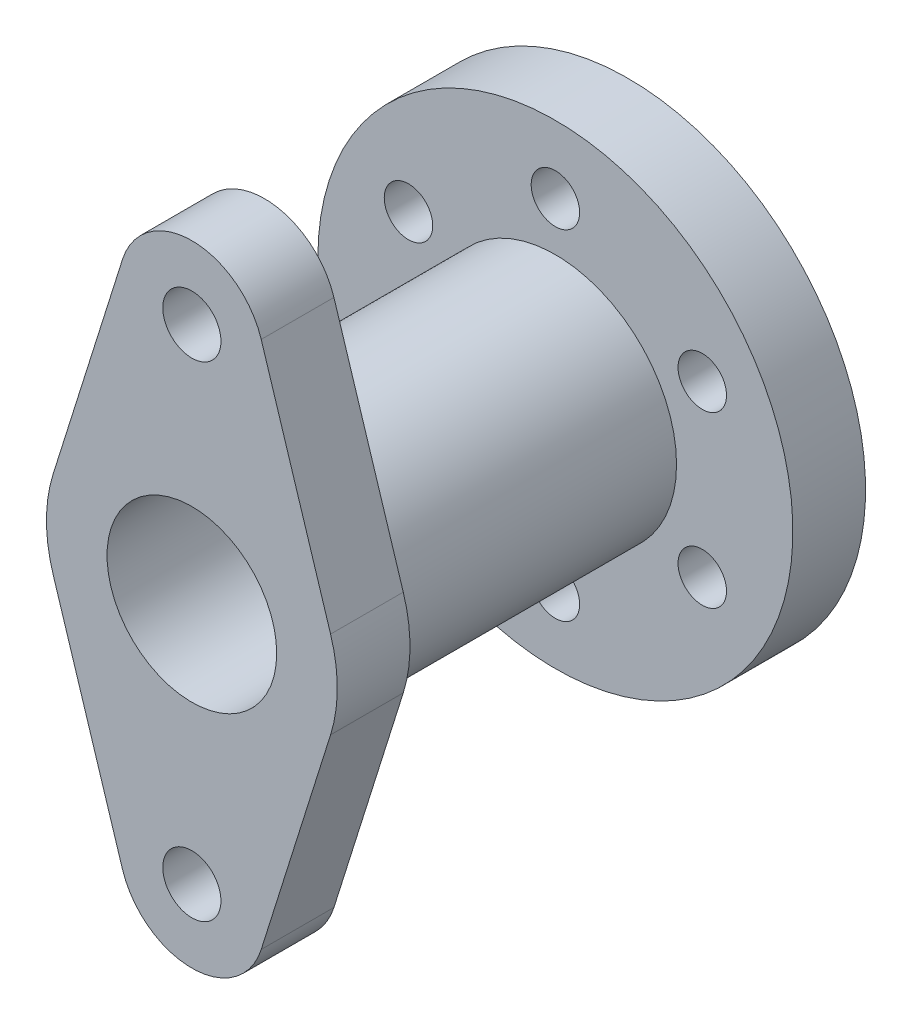
ISO-10303-21;
HEADER;
FILE_DESCRIPTION(('STEP AP214'),'2;1');
FILE_NAME('part.step','',(''),(''),'','','');
FILE_SCHEMA(('AUTOMOTIVE_DESIGN { 1 0 10303 214 1 1 1 1 }'));
ENDSEC;
DATA;
#1=APPLICATION_CONTEXT('core data for automotive mechanical design processes');
#2=APPLICATION_PROTOCOL_DEFINITION('international standard','automotive_design',2000,#1);
#3=PRODUCT_CONTEXT('',#1,'mechanical');
#4=PRODUCT('Part','Part','',(#3));
#5=PRODUCT_RELATED_PRODUCT_CATEGORY('part','',(#4));
#6=PRODUCT_DEFINITION_FORMATION('','',#4);
#7=PRODUCT_DEFINITION_CONTEXT('part definition',#1,'design');
#8=PRODUCT_DEFINITION('design','',#6,#7);
#9=PRODUCT_DEFINITION_SHAPE('','',#8);
#10=(LENGTH_UNIT() NAMED_UNIT(*) SI_UNIT(.MILLI.,.METRE.));
#11=(NAMED_UNIT(*) PLANE_ANGLE_UNIT() SI_UNIT($,.RADIAN.));
#12=(NAMED_UNIT(*) SI_UNIT($,.STERADIAN.) SOLID_ANGLE_UNIT());
#13=UNCERTAINTY_MEASURE_WITH_UNIT(LENGTH_MEASURE(1.E-05),#10,'distance_accuracy_value','');
#14=(GEOMETRIC_REPRESENTATION_CONTEXT(3) GLOBAL_UNCERTAINTY_ASSIGNED_CONTEXT((#13)) GLOBAL_UNIT_ASSIGNED_CONTEXT((#10,
#11,#12)) REPRESENTATION_CONTEXT('',''));
#15=CARTESIAN_POINT('',(0.,0.,0.));
#16=DIRECTION('',(0.,0.,1.));
#17=DIRECTION('',(1.,0.,0.));
#18=AXIS2_PLACEMENT_3D('',#15,#16,#17);
#19=CARTESIAN_POINT('',(0.,0.,15.));
#20=DIRECTION('',(0.,0.,1.));
#21=DIRECTION('',(1.,0.,0.));
#22=AXIS2_PLACEMENT_3D('',#19,#20,#21);
#23=PLANE('',#22);
#24=CARTESIAN_POINT('',(3.46944695195361E-13,-50.0000000000002,15.));
#25=DIRECTION('',(0.,0.,1.));
#26=DIRECTION('',(-1.,0.,0.));
#27=AXIS2_PLACEMENT_3D('',#24,#25,#26);
#28=CIRCLE('',#27,6.);
#29=CARTESIAN_POINT('',(-5.99999999999965,-50.0000000000002,15.));
#30=VERTEX_POINT('',#29);
#31=EDGE_CURVE('E186',#30,#30,#28,.T.);
#32=ORIENTED_EDGE('',*,*,#31,.F.);
#33=EDGE_LOOP('',(#32));
#34=FACE_BOUND('',#33,.T.);
#35=CARTESIAN_POINT('',(0.,0.,15.));
#36=DIRECTION('',(0.,0.,1.));
#37=DIRECTION('',(1.,0.,0.));
#38=AXIS2_PLACEMENT_3D('',#35,#36,#37);
#39=CIRCLE('',#38,30.);
#40=CARTESIAN_POINT('',(28.6181760425084,-9.,15.));
#41=VERTEX_POINT('',#40);
#42=CARTESIAN_POINT('',(28.6181760425084,9.,15.));
#43=VERTEX_POINT('',#42);
#44=EDGE_CURVE('E145',#41,#43,#39,.T.);
#45=ORIENTED_EDGE('',*,*,#44,.T.);
#46=DIRECTION('',(-0.3,0.953939201416946,0.));
#47=VECTOR('',#46,1.);
#48=CARTESIAN_POINT('',(14.3090880212542,54.5,15.));
#49=LINE('',#48,#47);
#50=CARTESIAN_POINT('',(14.3090880212542,54.5,15.));
#51=VERTEX_POINT('',#50);
#52=EDGE_CURVE('E93',#43,#51,#49,.T.);
#53=ORIENTED_EDGE('',*,*,#52,.T.);
#54=CARTESIAN_POINT('',(0.,50.,15.));
#55=DIRECTION('',(0.,0.,1.));
#56=DIRECTION('',(1.,0.,0.));
#57=AXIS2_PLACEMENT_3D('',#54,#55,#56);
#58=CIRCLE('',#57,15.);
#59=CARTESIAN_POINT('',(-14.3090880212542,54.5,15.));
#60=VERTEX_POINT('',#59);
#61=EDGE_CURVE('E177',#51,#60,#58,.T.);
#62=ORIENTED_EDGE('',*,*,#61,.T.);
#63=DIRECTION('',(-0.3,-0.953939201416946,0.));
#64=VECTOR('',#63,1.);
#65=CARTESIAN_POINT('',(-14.3090880212542,54.5,15.));
#66=LINE('',#65,#64);
#67=CARTESIAN_POINT('',(-28.6181760425084,9.00000000000001,15.));
#68=VERTEX_POINT('',#67);
#69=EDGE_CURVE('E176',#60,#68,#66,.T.);
#70=ORIENTED_EDGE('',*,*,#69,.T.);
#71=CARTESIAN_POINT('',(0.,0.,15.));
#72=DIRECTION('',(0.,0.,1.));
#73=DIRECTION('',(1.,0.,0.));
#74=AXIS2_PLACEMENT_3D('',#71,#72,#73);
#75=CIRCLE('',#74,30.);
#76=CARTESIAN_POINT('',(-28.6181760425084,-9.00000000000001,15.));
#77=VERTEX_POINT('',#76);
#78=EDGE_CURVE('E112',#68,#77,#75,.T.);
#79=ORIENTED_EDGE('',*,*,#78,.T.);
#80=DIRECTION('',(0.3,-0.953939201416946,0.));
#81=VECTOR('',#80,1.);
#82=CARTESIAN_POINT('',(-14.3090880212542,-54.5,15.));
#83=LINE('',#82,#81);
#84=CARTESIAN_POINT('',(-14.3090880212539,-54.4999999999999,15.));
#85=VERTEX_POINT('',#84);
#86=EDGE_CURVE('E106',#77,#85,#83,.T.);
#87=ORIENTED_EDGE('',*,*,#86,.T.);
#88=CARTESIAN_POINT('',(3.46944695195361E-13,-50.0000000000002,15.));
#89=DIRECTION('',(0.,0.,1.));
#90=DIRECTION('',(-1.,0.,0.));
#91=AXIS2_PLACEMENT_3D('',#88,#89,#90);
#92=CIRCLE('',#91,14.9999999999999);
#93=CARTESIAN_POINT('',(14.3090880212542,-54.5,15.));
#94=VERTEX_POINT('',#93);
#95=EDGE_CURVE('E110',#85,#94,#92,.T.);
#96=ORIENTED_EDGE('',*,*,#95,.T.);
#97=DIRECTION('',(0.3,0.953939201416946,0.));
#98=VECTOR('',#97,1.);
#99=CARTESIAN_POINT('',(14.3090880212542,-54.5,15.));
#100=LINE('',#99,#98);
#101=EDGE_CURVE('E49',#94,#41,#100,.T.);
#102=ORIENTED_EDGE('',*,*,#101,.T.);
#103=EDGE_LOOP('',(#45,#53,#62,#70,#79,#87,#96,#102));
#104=FACE_BOUND('',#103,.T.);
#105=CARTESIAN_POINT('',(0.,50.,15.));
#106=DIRECTION('',(0.,0.,1.));
#107=DIRECTION('',(1.,0.,0.));
#108=AXIS2_PLACEMENT_3D('',#105,#106,#107);
#109=CIRCLE('',#108,6.);
#110=CARTESIAN_POINT('',(6.,50.,15.));
#111=VERTEX_POINT('',#110);
#112=EDGE_CURVE('E134',#111,#111,#109,.T.);
#113=ORIENTED_EDGE('',*,*,#112,.F.);
#114=EDGE_LOOP('',(#113));
#115=FACE_BOUND('',#114,.T.);
#116=CARTESIAN_POINT('',(0.,0.,15.));
#117=DIRECTION('',(0.,0.,1.));
#118=DIRECTION('',(1.,0.,0.));
#119=AXIS2_PLACEMENT_3D('',#116,#117,#118);
#120=CIRCLE('',#119,17.5);
#121=CARTESIAN_POINT('',(17.5,0.,15.));
#122=VERTEX_POINT('',#121);
#123=EDGE_CURVE('E192',#122,#122,#120,.T.);
#124=ORIENTED_EDGE('',*,*,#123,.F.);
#125=EDGE_LOOP('',(#124));
#126=FACE_BOUND('',#125,.T.);
#127=ADVANCED_FACE('F32',(#34,#104,#115,#126),#23,.T.);
#128=CARTESIAN_POINT('',(0.,0.,0.));
#129=DIRECTION('',(0.,0.,1.));
#130=DIRECTION('',(1.,0.,0.));
#131=AXIS2_PLACEMENT_3D('',#128,#129,#130);
#132=PLANE('',#131);
#133=CARTESIAN_POINT('',(0.,0.,0.));
#134=DIRECTION('',(0.,0.,1.));
#135=DIRECTION('',(1.,0.,0.));
#136=AXIS2_PLACEMENT_3D('',#133,#134,#135);
#137=CIRCLE('',#136,25.);
#138=CARTESIAN_POINT('',(25.,0.,0.));
#139=VERTEX_POINT('',#138);
#140=EDGE_CURVE('E11',#139,#139,#137,.F.);
#141=ORIENTED_EDGE('',*,*,#140,.F.);
#142=EDGE_LOOP('',(#141));
#143=FACE_BOUND('',#142,.T.);
#144=CARTESIAN_POINT('',(0.,0.,0.));
#145=DIRECTION('',(0.,0.,1.));
#146=DIRECTION('',(1.,0.,0.));
#147=AXIS2_PLACEMENT_3D('',#144,#145,#146);
#148=CIRCLE('',#147,30.);
#149=CARTESIAN_POINT('',(28.6181760425084,-9.,0.));
#150=VERTEX_POINT('',#149);
#151=CARTESIAN_POINT('',(28.6181760425084,9.,0.));
#152=VERTEX_POINT('',#151);
#153=EDGE_CURVE('E130',#150,#152,#148,.T.);
#154=ORIENTED_EDGE('',*,*,#153,.F.);
#155=DIRECTION('',(0.3,0.953939201416946,0.));
#156=VECTOR('',#155,1.);
#157=CARTESIAN_POINT('',(14.3090880212542,-54.5,0.));
#158=LINE('',#157,#156);
#159=CARTESIAN_POINT('',(14.3090880212542,-54.5,0.));
#160=VERTEX_POINT('',#159);
#161=EDGE_CURVE('E84',#160,#150,#158,.T.);
#162=ORIENTED_EDGE('',*,*,#161,.F.);
#163=CARTESIAN_POINT('',(3.46944695195361E-13,-50.0000000000002,0.));
#164=DIRECTION('',(0.,0.,1.));
#165=DIRECTION('',(-1.,0.,0.));
#166=AXIS2_PLACEMENT_3D('',#163,#164,#165);
#167=CIRCLE('',#166,14.9999999999999);
#168=CARTESIAN_POINT('',(-14.3090880212539,-54.4999999999999,0.));
#169=VERTEX_POINT('',#168);
#170=EDGE_CURVE('E78',#169,#160,#167,.T.);
#171=ORIENTED_EDGE('',*,*,#170,.F.);
#172=DIRECTION('',(0.3,-0.953939201416946,0.));
#173=VECTOR('',#172,1.);
#174=CARTESIAN_POINT('',(-14.3090880212542,-54.5,0.));
#175=LINE('',#174,#173);
#176=CARTESIAN_POINT('',(-28.6181760425084,-9.00000000000001,0.));
#177=VERTEX_POINT('',#176);
#178=EDGE_CURVE('E120',#177,#169,#175,.T.);
#179=ORIENTED_EDGE('',*,*,#178,.F.);
#180=CARTESIAN_POINT('',(0.,0.,0.));
#181=DIRECTION('',(0.,0.,1.));
#182=DIRECTION('',(1.,0.,0.));
#183=AXIS2_PLACEMENT_3D('',#180,#181,#182);
#184=CIRCLE('',#183,30.);
#185=CARTESIAN_POINT('',(-28.6181760425084,9.00000000000001,0.));
#186=VERTEX_POINT('',#185);
#187=EDGE_CURVE('E140',#186,#177,#184,.T.);
#188=ORIENTED_EDGE('',*,*,#187,.F.);
#189=DIRECTION('',(-0.3,-0.953939201416946,0.));
#190=VECTOR('',#189,1.);
#191=CARTESIAN_POINT('',(-14.3090880212542,54.5,0.));
#192=LINE('',#191,#190);
#193=CARTESIAN_POINT('',(-14.3090880212542,54.5,0.));
#194=VERTEX_POINT('',#193);
#195=EDGE_CURVE('E138',#194,#186,#192,.T.);
#196=ORIENTED_EDGE('',*,*,#195,.F.);
#197=CARTESIAN_POINT('',(0.,50.,0.));
#198=DIRECTION('',(0.,0.,1.));
#199=DIRECTION('',(1.,0.,0.));
#200=AXIS2_PLACEMENT_3D('',#197,#198,#199);
#201=CIRCLE('',#200,15.);
#202=CARTESIAN_POINT('',(14.3090880212542,54.5,0.));
#203=VERTEX_POINT('',#202);
#204=EDGE_CURVE('E136',#203,#194,#201,.T.);
#205=ORIENTED_EDGE('',*,*,#204,.F.);
#206=DIRECTION('',(-0.3,0.953939201416946,0.));
#207=VECTOR('',#206,1.);
#208=CARTESIAN_POINT('',(14.3090880212542,54.5,0.));
#209=LINE('',#208,#207);
#210=EDGE_CURVE('E133',#152,#203,#209,.T.);
#211=ORIENTED_EDGE('',*,*,#210,.F.);
#212=EDGE_LOOP('',(#154,#162,#171,#179,#188,#196,#205,#211));
#213=FACE_BOUND('',#212,.T.);
#214=CARTESIAN_POINT('',(0.,50.,0.));
#215=DIRECTION('',(0.,0.,1.));
#216=DIRECTION('',(1.,0.,0.));
#217=AXIS2_PLACEMENT_3D('',#214,#215,#216);
#218=CIRCLE('',#217,6.);
#219=CARTESIAN_POINT('',(6.,50.,0.));
#220=VERTEX_POINT('',#219);
#221=EDGE_CURVE('E183',#220,#220,#218,.T.);
#222=ORIENTED_EDGE('',*,*,#221,.T.);
#223=EDGE_LOOP('',(#222));
#224=FACE_BOUND('',#223,.T.);
#225=CARTESIAN_POINT('',(3.46944695195361E-13,-50.0000000000002,0.));
#226=DIRECTION('',(0.,0.,1.));
#227=DIRECTION('',(-1.,0.,0.));
#228=AXIS2_PLACEMENT_3D('',#225,#226,#227);
#229=CIRCLE('',#228,6.);
#230=CARTESIAN_POINT('',(-5.99999999999965,-50.0000000000002,0.));
#231=VERTEX_POINT('',#230);
#232=EDGE_CURVE('E189',#231,#231,#229,.T.);
#233=ORIENTED_EDGE('',*,*,#232,.T.);
#234=EDGE_LOOP('',(#233));
#235=FACE_BOUND('',#234,.T.);
#236=ADVANCED_FACE('F163',(#143,#213,#224,#235),#132,.F.);
#237=CARTESIAN_POINT('',(0.,0.,15.));
#238=DIRECTION('',(0.,0.,-1.));
#239=DIRECTION('',(-1.,0.,0.));
#240=AXIS2_PLACEMENT_3D('',#237,#238,#239);
#241=CYLINDRICAL_SURFACE('',#240,30.);
#242=ORIENTED_EDGE('',*,*,#153,.T.);
#243=DIRECTION('',(0.,0.,-1.));
#244=VECTOR('',#243,1.);
#245=CARTESIAN_POINT('',(28.6181760425084,9.,15.));
#246=LINE('',#245,#244);
#247=EDGE_CURVE('E41',#43,#152,#246,.T.);
#248=ORIENTED_EDGE('',*,*,#247,.F.);
#249=ORIENTED_EDGE('',*,*,#44,.F.);
#250=DIRECTION('',(0.,0.,-1.));
#251=VECTOR('',#250,1.);
#252=CARTESIAN_POINT('',(28.6181760425084,-9.,15.));
#253=LINE('',#252,#251);
#254=EDGE_CURVE('E126',#41,#150,#253,.T.);
#255=ORIENTED_EDGE('',*,*,#254,.T.);
#256=EDGE_LOOP('',(#242,#248,#249,#255));
#257=FACE_BOUND('',#256,.T.);
#258=ADVANCED_FACE('F34',(#257),#241,.T.);
#259=CARTESIAN_POINT('',(14.3090880212542,54.5,15.));
#260=DIRECTION('',(-0.953939201416946,-0.3,0.));
#261=DIRECTION('',(0.3,-0.953939201416946,0.));
#262=AXIS2_PLACEMENT_3D('',#259,#260,#261);
#263=PLANE('',#262);
#264=ORIENTED_EDGE('',*,*,#210,.T.);
#265=DIRECTION('',(0.,0.,-1.));
#266=VECTOR('',#265,1.);
#267=CARTESIAN_POINT('',(14.3090880212542,54.5,15.));
#268=LINE('',#267,#266);
#269=EDGE_CURVE('E155',#51,#203,#268,.T.);
#270=ORIENTED_EDGE('',*,*,#269,.F.);
#271=ORIENTED_EDGE('',*,*,#52,.F.);
#272=ORIENTED_EDGE('',*,*,#247,.T.);
#273=EDGE_LOOP('',(#264,#270,#271,#272));
#274=FACE_BOUND('',#273,.T.);
#275=ADVANCED_FACE('F158',(#274),#263,.F.);
#276=CARTESIAN_POINT('',(0.,50.,15.));
#277=DIRECTION('',(0.,0.,-1.));
#278=DIRECTION('',(-1.,0.,0.));
#279=AXIS2_PLACEMENT_3D('',#276,#277,#278);
#280=CYLINDRICAL_SURFACE('',#279,15.);
#281=ORIENTED_EDGE('',*,*,#204,.T.);
#282=DIRECTION('',(0.,0.,-1.));
#283=VECTOR('',#282,1.);
#284=CARTESIAN_POINT('',(-14.3090880212542,54.5,15.));
#285=LINE('',#284,#283);
#286=EDGE_CURVE('E152',#60,#194,#285,.T.);
#287=ORIENTED_EDGE('',*,*,#286,.F.);
#288=ORIENTED_EDGE('',*,*,#61,.F.);
#289=ORIENTED_EDGE('',*,*,#269,.T.);
#290=EDGE_LOOP('',(#281,#287,#288,#289));
#291=FACE_BOUND('',#290,.T.);
#292=ADVANCED_FACE('F170',(#291),#280,.T.);
#293=CARTESIAN_POINT('',(-14.3090880212542,54.5,15.));
#294=DIRECTION('',(0.953939201416946,-0.3,0.));
#295=DIRECTION('',(0.3,0.953939201416946,0.));
#296=AXIS2_PLACEMENT_3D('',#293,#294,#295);
#297=PLANE('',#296);
#298=ORIENTED_EDGE('',*,*,#195,.T.);
#299=DIRECTION('',(0.,0.,-1.));
#300=VECTOR('',#299,1.);
#301=CARTESIAN_POINT('',(-28.6181760425084,9.00000000000001,15.));
#302=LINE('',#301,#300);
#303=EDGE_CURVE('E149',#68,#186,#302,.T.);
#304=ORIENTED_EDGE('',*,*,#303,.F.);
#305=ORIENTED_EDGE('',*,*,#69,.F.);
#306=ORIENTED_EDGE('',*,*,#286,.T.);
#307=EDGE_LOOP('',(#298,#304,#305,#306));
#308=FACE_BOUND('',#307,.T.);
#309=ADVANCED_FACE('F174',(#308),#297,.F.);
#310=CARTESIAN_POINT('',(0.,0.,15.));
#311=DIRECTION('',(0.,0.,-1.));
#312=DIRECTION('',(-1.,0.,0.));
#313=AXIS2_PLACEMENT_3D('',#310,#311,#312);
#314=CYLINDRICAL_SURFACE('',#313,30.);
#315=ORIENTED_EDGE('',*,*,#187,.T.);
#316=DIRECTION('',(0.,0.,-1.));
#317=VECTOR('',#316,1.);
#318=CARTESIAN_POINT('',(-28.6181760425084,-9.00000000000001,15.));
#319=LINE('',#318,#317);
#320=EDGE_CURVE('E121',#77,#177,#319,.T.);
#321=ORIENTED_EDGE('',*,*,#320,.F.);
#322=ORIENTED_EDGE('',*,*,#78,.F.);
#323=ORIENTED_EDGE('',*,*,#303,.T.);
#324=EDGE_LOOP('',(#315,#321,#322,#323));
#325=FACE_BOUND('',#324,.T.);
#326=ADVANCED_FACE('F283',(#325),#314,.T.);
#327=CARTESIAN_POINT('',(-14.3090880212542,-54.5,15.));
#328=DIRECTION('',(0.953939201416946,0.3,0.));
#329=DIRECTION('',(-0.3,0.953939201416946,0.));
#330=AXIS2_PLACEMENT_3D('',#327,#328,#329);
#331=PLANE('',#330);
#332=ORIENTED_EDGE('',*,*,#178,.T.);
#333=DIRECTION('',(0.,0.,-1.));
#334=VECTOR('',#333,1.);
#335=CARTESIAN_POINT('',(-14.3090880212539,-54.4999999999999,15.));
#336=LINE('',#335,#334);
#337=EDGE_CURVE('E117',#85,#169,#336,.T.);
#338=ORIENTED_EDGE('',*,*,#337,.F.);
#339=ORIENTED_EDGE('',*,*,#86,.F.);
#340=ORIENTED_EDGE('',*,*,#320,.T.);
#341=EDGE_LOOP('',(#332,#338,#339,#340));
#342=FACE_BOUND('',#341,.T.);
#343=ADVANCED_FACE('F118',(#342),#331,.F.);
#344=CARTESIAN_POINT('',(3.46944695195361E-13,-50.0000000000002,15.));
#345=DIRECTION('',(0.,0.,-1.));
#346=DIRECTION('',(-1.,0.,0.));
#347=AXIS2_PLACEMENT_3D('',#344,#345,#346);
#348=CYLINDRICAL_SURFACE('',#347,14.9999999999999);
#349=ORIENTED_EDGE('',*,*,#170,.T.);
#350=DIRECTION('',(0.,0.,-1.));
#351=VECTOR('',#350,1.);
#352=CARTESIAN_POINT('',(14.3090880212542,-54.5,15.));
#353=LINE('',#352,#351);
#354=EDGE_CURVE('E122',#94,#160,#353,.T.);
#355=ORIENTED_EDGE('',*,*,#354,.F.);
#356=ORIENTED_EDGE('',*,*,#95,.F.);
#357=ORIENTED_EDGE('',*,*,#337,.T.);
#358=EDGE_LOOP('',(#349,#355,#356,#357));
#359=FACE_BOUND('',#358,.T.);
#360=ADVANCED_FACE('F124',(#359),#348,.T.);
#361=CARTESIAN_POINT('',(14.3090880212542,-54.5,15.));
#362=DIRECTION('',(-0.953939201416946,0.3,0.));
#363=DIRECTION('',(-0.3,-0.953939201416946,0.));
#364=AXIS2_PLACEMENT_3D('',#361,#362,#363);
#365=PLANE('',#364);
#366=ORIENTED_EDGE('',*,*,#161,.T.);
#367=ORIENTED_EDGE('',*,*,#254,.F.);
#368=ORIENTED_EDGE('',*,*,#101,.F.);
#369=ORIENTED_EDGE('',*,*,#354,.T.);
#370=EDGE_LOOP('',(#366,#367,#368,#369));
#371=FACE_BOUND('',#370,.T.);
#372=ADVANCED_FACE('F276',(#371),#365,.F.);
#373=CARTESIAN_POINT('',(0.,50.,15.));
#374=DIRECTION('',(0.,0.,-1.));
#375=DIRECTION('',(-1.,0.,0.));
#376=AXIS2_PLACEMENT_3D('',#373,#374,#375);
#377=CYLINDRICAL_SURFACE('',#376,6.);
#378=ORIENTED_EDGE('',*,*,#112,.T.);
#379=EDGE_LOOP('',(#378));
#380=FACE_BOUND('',#379,.T.);
#381=ORIENTED_EDGE('',*,*,#221,.F.);
#382=EDGE_LOOP('',(#381));
#383=FACE_BOUND('',#382,.T.);
#384=ADVANCED_FACE('F262',(#380,#383),#377,.F.);
#385=CARTESIAN_POINT('',(3.46944695195361E-13,-50.0000000000002,15.));
#386=DIRECTION('',(0.,0.,-1.));
#387=DIRECTION('',(-1.,0.,0.));
#388=AXIS2_PLACEMENT_3D('',#385,#386,#387);
#389=CYLINDRICAL_SURFACE('',#388,6.);
#390=ORIENTED_EDGE('',*,*,#31,.T.);
#391=EDGE_LOOP('',(#390));
#392=FACE_BOUND('',#391,.T.);
#393=ORIENTED_EDGE('',*,*,#232,.F.);
#394=EDGE_LOOP('',(#393));
#395=FACE_BOUND('',#394,.T.);
#396=ADVANCED_FACE('F252',(#392,#395),#389,.F.);
#397=CARTESIAN_POINT('',(0.,0.,15.));
#398=DIRECTION('',(0.,0.,-1.));
#399=DIRECTION('',(-1.,0.,0.));
#400=AXIS2_PLACEMENT_3D('',#397,#398,#399);
#401=CYLINDRICAL_SURFACE('',#400,17.5);
#402=ORIENTED_EDGE('',*,*,#123,.T.);
#403=EDGE_LOOP('',(#402));
#404=FACE_BOUND('',#403,.T.);
#405=CARTESIAN_POINT('',(0.,0.,-75.));
#406=DIRECTION('',(0.,0.,1.));
#407=DIRECTION('',(1.,0.,0.));
#408=AXIS2_PLACEMENT_3D('',#405,#406,#407);
#409=CIRCLE('',#408,17.5);
#410=CARTESIAN_POINT('',(17.5,0.,-75.));
#411=VERTEX_POINT('',#410);
#412=EDGE_CURVE('E240',#411,#411,#409,.T.);
#413=ORIENTED_EDGE('',*,*,#412,.F.);
#414=EDGE_LOOP('',(#413));
#415=FACE_BOUND('',#414,.T.);
#416=ADVANCED_FACE('F249',(#404,#415),#401,.F.);
#417=CARTESIAN_POINT('',(0.,0.,-60.));
#418=DIRECTION('',(0.,0.,1.));
#419=DIRECTION('',(1.,0.,0.));
#420=AXIS2_PLACEMENT_3D('',#417,#418,#419);
#421=CYLINDRICAL_SURFACE('',#420,25.);
#422=CARTESIAN_POINT('',(0.,0.,-60.));
#423=DIRECTION('',(0.,0.,-1.));
#424=DIRECTION('',(-1.,0.,0.));
#425=AXIS2_PLACEMENT_3D('',#422,#423,#424);
#426=CIRCLE('',#425,25.);
#427=CARTESIAN_POINT('',(-25.,0.,-60.));
#428=VERTEX_POINT('',#427);
#429=EDGE_CURVE('E197',#428,#428,#426,.T.);
#430=ORIENTED_EDGE('',*,*,#429,.F.);
#431=EDGE_LOOP('',(#430));
#432=FACE_BOUND('',#431,.T.);
#433=ORIENTED_EDGE('',*,*,#140,.T.);
#434=EDGE_LOOP('',(#433));
#435=FACE_BOUND('',#434,.T.);
#436=ADVANCED_FACE('F251',(#432,#435),#421,.T.);
#437=CARTESIAN_POINT('',(0.,0.,-75.));
#438=DIRECTION('',(0.,0.,1.));
#439=DIRECTION('',(1.,0.,0.));
#440=AXIS2_PLACEMENT_3D('',#437,#438,#439);
#441=CYLINDRICAL_SURFACE('',#440,49.);
#442=CARTESIAN_POINT('',(0.,0.,-75.));
#443=DIRECTION('',(0.,0.,-1.));
#444=DIRECTION('',(-1.,0.,0.));
#445=AXIS2_PLACEMENT_3D('',#442,#443,#444);
#446=CIRCLE('',#445,49.);
#447=CARTESIAN_POINT('',(-49.,0.,-75.));
#448=VERTEX_POINT('',#447);
#449=EDGE_CURVE('E200',#448,#448,#446,.T.);
#450=ORIENTED_EDGE('',*,*,#449,.F.);
#451=EDGE_LOOP('',(#450));
#452=FACE_BOUND('',#451,.T.);
#453=CARTESIAN_POINT('',(0.,0.,-60.));
#454=DIRECTION('',(0.,0.,-1.));
#455=DIRECTION('',(-1.,0.,0.));
#456=AXIS2_PLACEMENT_3D('',#453,#454,#455);
#457=CIRCLE('',#456,49.);
#458=CARTESIAN_POINT('',(-49.,0.,-60.));
#459=VERTEX_POINT('',#458);
#460=EDGE_CURVE('E201',#459,#459,#457,.T.);
#461=ORIENTED_EDGE('',*,*,#460,.T.);
#462=EDGE_LOOP('',(#461));
#463=FACE_BOUND('',#462,.T.);
#464=ADVANCED_FACE('F259',(#452,#463),#441,.T.);
#465=CARTESIAN_POINT('',(0.,0.,-75.));
#466=DIRECTION('',(0.,0.,-1.));
#467=DIRECTION('',(-1.,0.,0.));
#468=AXIS2_PLACEMENT_3D('',#465,#466,#467);
#469=PLANE('',#468);
#470=ORIENTED_EDGE('',*,*,#412,.T.);
#471=EDGE_LOOP('',(#470));
#472=FACE_BOUND('',#471,.T.);
#473=CARTESIAN_POINT('',(30.3108891324546,17.4999999999987,-75.));
#474=DIRECTION('',(0.,0.,-1.));
#475=DIRECTION('',(-1.,0.,0.));
#476=AXIS2_PLACEMENT_3D('',#473,#474,#475);
#477=CIRCLE('',#476,5.00000000000151);
#478=CARTESIAN_POINT('',(25.3108891324531,17.4999999999987,-75.));
#479=VERTEX_POINT('',#478);
#480=EDGE_CURVE('E237',#479,#479,#477,.T.);
#481=ORIENTED_EDGE('',*,*,#480,.F.);
#482=EDGE_LOOP('',(#481));
#483=FACE_BOUND('',#482,.T.);
#484=CARTESIAN_POINT('',(30.3108891324531,-17.5000000000013,-75.));
#485=DIRECTION('',(0.,0.,-1.));
#486=DIRECTION('',(-1.,0.,0.));
#487=AXIS2_PLACEMENT_3D('',#484,#485,#486);
#488=CIRCLE('',#487,5.00000000000283);
#489=CARTESIAN_POINT('',(25.3108891324503,-17.5000000000013,-75.));
#490=VERTEX_POINT('',#489);
#491=EDGE_CURVE('E231',#490,#490,#488,.T.);
#492=ORIENTED_EDGE('',*,*,#491,.F.);
#493=EDGE_LOOP('',(#492));
#494=FACE_BOUND('',#493,.T.);
#495=CARTESIAN_POINT('',(-2.97570696259839E-12,-35.,-75.));
#496=DIRECTION('',(0.,0.,-1.));
#497=DIRECTION('',(-1.,0.,0.));
#498=AXIS2_PLACEMENT_3D('',#495,#496,#497);
#499=CIRCLE('',#498,5.00000000000308);
#500=CARTESIAN_POINT('',(-5.00000000000605,-35.,-75.));
#501=VERTEX_POINT('',#500);
#502=EDGE_CURVE('E225',#501,#501,#499,.T.);
#503=ORIENTED_EDGE('',*,*,#502,.F.);
#504=EDGE_LOOP('',(#503));
#505=FACE_BOUND('',#504,.T.);
#506=CARTESIAN_POINT('',(-30.3108891324576,-17.4999999999987,-75.));
#507=DIRECTION('',(0.,0.,-1.));
#508=DIRECTION('',(-1.,0.,0.));
#509=AXIS2_PLACEMENT_3D('',#506,#507,#508);
#510=CIRCLE('',#509,5.00000000000192);
#511=CARTESIAN_POINT('',(-35.3108891324595,-17.4999999999987,-75.));
#512=VERTEX_POINT('',#511);
#513=EDGE_CURVE('E219',#512,#512,#510,.T.);
#514=ORIENTED_EDGE('',*,*,#513,.F.);
#515=EDGE_LOOP('',(#514));
#516=FACE_BOUND('',#515,.T.);
#517=CARTESIAN_POINT('',(-30.3108891324561,17.5000000000013,-75.));
#518=DIRECTION('',(0.,0.,-1.));
#519=DIRECTION('',(-1.,0.,0.));
#520=AXIS2_PLACEMENT_3D('',#517,#518,#519);
#521=CIRCLE('',#520,5.00000000000041);
#522=CARTESIAN_POINT('',(-35.3108891324565,17.5000000000013,-75.));
#523=VERTEX_POINT('',#522);
#524=EDGE_CURVE('E213',#523,#523,#521,.T.);
#525=ORIENTED_EDGE('',*,*,#524,.F.);
#526=EDGE_LOOP('',(#525));
#527=FACE_BOUND('',#526,.T.);
#528=CARTESIAN_POINT('',(0.,35.,-75.));
#529=DIRECTION('',(0.,0.,-1.));
#530=DIRECTION('',(-1.,0.,0.));
#531=AXIS2_PLACEMENT_3D('',#528,#529,#530);
#532=CIRCLE('',#531,5.);
#533=CARTESIAN_POINT('',(-5.,35.,-75.));
#534=VERTEX_POINT('',#533);
#535=EDGE_CURVE('E207',#534,#534,#532,.T.);
#536=ORIENTED_EDGE('',*,*,#535,.F.);
#537=EDGE_LOOP('',(#536));
#538=FACE_BOUND('',#537,.T.);
#539=ORIENTED_EDGE('',*,*,#449,.T.);
#540=EDGE_LOOP('',(#539));
#541=FACE_BOUND('',#540,.T.);
#542=ADVANCED_FACE('F246',(#472,#483,#494,#505,#516,#527,#538,#541),#469,.T.);
#543=CARTESIAN_POINT('',(0.,0.,-60.));
#544=DIRECTION('',(0.,0.,-1.));
#545=DIRECTION('',(-1.,0.,0.));
#546=AXIS2_PLACEMENT_3D('',#543,#544,#545);
#547=PLANE('',#546);
#548=CARTESIAN_POINT('',(30.3108891324546,17.4999999999987,-60.));
#549=DIRECTION('',(0.,0.,-1.));
#550=DIRECTION('',(-1.,0.,0.));
#551=AXIS2_PLACEMENT_3D('',#548,#549,#550);
#552=CIRCLE('',#551,5.00000000000151);
#553=CARTESIAN_POINT('',(25.3108891324531,17.4999999999987,-60.));
#554=VERTEX_POINT('',#553);
#555=EDGE_CURVE('E234',#554,#554,#552,.T.);
#556=ORIENTED_EDGE('',*,*,#555,.T.);
#557=EDGE_LOOP('',(#556));
#558=FACE_BOUND('',#557,.T.);
#559=CARTESIAN_POINT('',(30.3108891324531,-17.5000000000013,-60.));
#560=DIRECTION('',(0.,0.,-1.));
#561=DIRECTION('',(-1.,0.,0.));
#562=AXIS2_PLACEMENT_3D('',#559,#560,#561);
#563=CIRCLE('',#562,5.00000000000283);
#564=CARTESIAN_POINT('',(25.3108891324503,-17.5000000000013,-60.));
#565=VERTEX_POINT('',#564);
#566=EDGE_CURVE('E228',#565,#565,#563,.T.);
#567=ORIENTED_EDGE('',*,*,#566,.T.);
#568=EDGE_LOOP('',(#567));
#569=FACE_BOUND('',#568,.T.);
#570=CARTESIAN_POINT('',(-2.97570696259839E-12,-35.,-60.));
#571=DIRECTION('',(0.,0.,-1.));
#572=DIRECTION('',(-1.,0.,0.));
#573=AXIS2_PLACEMENT_3D('',#570,#571,#572);
#574=CIRCLE('',#573,5.00000000000308);
#575=CARTESIAN_POINT('',(-5.00000000000605,-35.,-60.));
#576=VERTEX_POINT('',#575);
#577=EDGE_CURVE('E222',#576,#576,#574,.T.);
#578=ORIENTED_EDGE('',*,*,#577,.T.);
#579=EDGE_LOOP('',(#578));
#580=FACE_BOUND('',#579,.T.);
#581=CARTESIAN_POINT('',(-30.3108891324576,-17.4999999999987,-60.));
#582=DIRECTION('',(0.,0.,-1.));
#583=DIRECTION('',(-1.,0.,0.));
#584=AXIS2_PLACEMENT_3D('',#581,#582,#583);
#585=CIRCLE('',#584,5.00000000000192);
#586=CARTESIAN_POINT('',(-35.3108891324595,-17.4999999999987,-60.));
#587=VERTEX_POINT('',#586);
#588=EDGE_CURVE('E216',#587,#587,#585,.T.);
#589=ORIENTED_EDGE('',*,*,#588,.T.);
#590=EDGE_LOOP('',(#589));
#591=FACE_BOUND('',#590,.T.);
#592=CARTESIAN_POINT('',(-30.3108891324561,17.5000000000013,-60.));
#593=DIRECTION('',(0.,0.,-1.));
#594=DIRECTION('',(-1.,0.,0.));
#595=AXIS2_PLACEMENT_3D('',#592,#593,#594);
#596=CIRCLE('',#595,5.00000000000041);
#597=CARTESIAN_POINT('',(-35.3108891324565,17.5000000000013,-60.));
#598=VERTEX_POINT('',#597);
#599=EDGE_CURVE('E210',#598,#598,#596,.T.);
#600=ORIENTED_EDGE('',*,*,#599,.T.);
#601=EDGE_LOOP('',(#600));
#602=FACE_BOUND('',#601,.T.);
#603=CARTESIAN_POINT('',(0.,35.,-60.));
#604=DIRECTION('',(0.,0.,-1.));
#605=DIRECTION('',(-1.,0.,0.));
#606=AXIS2_PLACEMENT_3D('',#603,#604,#605);
#607=CIRCLE('',#606,5.);
#608=CARTESIAN_POINT('',(-5.,35.,-60.));
#609=VERTEX_POINT('',#608);
#610=EDGE_CURVE('E204',#609,#609,#607,.T.);
#611=ORIENTED_EDGE('',*,*,#610,.T.);
#612=EDGE_LOOP('',(#611));
#613=FACE_BOUND('',#612,.T.);
#614=ORIENTED_EDGE('',*,*,#429,.T.);
#615=EDGE_LOOP('',(#614));
#616=FACE_BOUND('',#615,.T.);
#617=ORIENTED_EDGE('',*,*,#460,.F.);
#618=EDGE_LOOP('',(#617));
#619=FACE_BOUND('',#618,.T.);
#620=ADVANCED_FACE('F328',(#558,#569,#580,#591,#602,#613,#616,#619),#547,.F.);
#621=CARTESIAN_POINT('',(0.,35.,-60.));
#622=DIRECTION('',(0.,0.,-1.));
#623=DIRECTION('',(-1.,0.,0.));
#624=AXIS2_PLACEMENT_3D('',#621,#622,#623);
#625=CYLINDRICAL_SURFACE('',#624,5.);
#626=ORIENTED_EDGE('',*,*,#610,.F.);
#627=EDGE_LOOP('',(#626));
#628=FACE_BOUND('',#627,.T.);
#629=ORIENTED_EDGE('',*,*,#535,.T.);
#630=EDGE_LOOP('',(#629));
#631=FACE_BOUND('',#630,.T.);
#632=ADVANCED_FACE('F333',(#628,#631),#625,.F.);
#633=CARTESIAN_POINT('',(-30.3108891324561,17.5000000000013,-60.));
#634=DIRECTION('',(0.,0.,-1.));
#635=DIRECTION('',(-1.,0.,0.));
#636=AXIS2_PLACEMENT_3D('',#633,#634,#635);
#637=CYLINDRICAL_SURFACE('',#636,5.00000000000041);
#638=ORIENTED_EDGE('',*,*,#599,.F.);
#639=EDGE_LOOP('',(#638));
#640=FACE_BOUND('',#639,.T.);
#641=ORIENTED_EDGE('',*,*,#524,.T.);
#642=EDGE_LOOP('',(#641));
#643=FACE_BOUND('',#642,.T.);
#644=ADVANCED_FACE('F343',(#640,#643),#637,.F.);
#645=CARTESIAN_POINT('',(-30.3108891324576,-17.4999999999987,-60.));
#646=DIRECTION('',(0.,0.,-1.));
#647=DIRECTION('',(-1.,0.,0.));
#648=AXIS2_PLACEMENT_3D('',#645,#646,#647);
#649=CYLINDRICAL_SURFACE('',#648,5.00000000000192);
#650=ORIENTED_EDGE('',*,*,#588,.F.);
#651=EDGE_LOOP('',(#650));
#652=FACE_BOUND('',#651,.T.);
#653=ORIENTED_EDGE('',*,*,#513,.T.);
#654=EDGE_LOOP('',(#653));
#655=FACE_BOUND('',#654,.T.);
#656=ADVANCED_FACE('F353',(#652,#655),#649,.F.);
#657=CARTESIAN_POINT('',(-2.97570696259839E-12,-35.,-60.));
#658=DIRECTION('',(0.,0.,-1.));
#659=DIRECTION('',(-1.,0.,0.));
#660=AXIS2_PLACEMENT_3D('',#657,#658,#659);
#661=CYLINDRICAL_SURFACE('',#660,5.00000000000308);
#662=ORIENTED_EDGE('',*,*,#577,.F.);
#663=EDGE_LOOP('',(#662));
#664=FACE_BOUND('',#663,.T.);
#665=ORIENTED_EDGE('',*,*,#502,.T.);
#666=EDGE_LOOP('',(#665));
#667=FACE_BOUND('',#666,.T.);
#668=ADVANCED_FACE('F363',(#664,#667),#661,.F.);
#669=CARTESIAN_POINT('',(30.3108891324531,-17.5000000000013,-60.));
#670=DIRECTION('',(0.,0.,-1.));
#671=DIRECTION('',(-1.,0.,0.));
#672=AXIS2_PLACEMENT_3D('',#669,#670,#671);
#673=CYLINDRICAL_SURFACE('',#672,5.00000000000283);
#674=ORIENTED_EDGE('',*,*,#566,.F.);
#675=EDGE_LOOP('',(#674));
#676=FACE_BOUND('',#675,.T.);
#677=ORIENTED_EDGE('',*,*,#491,.T.);
#678=EDGE_LOOP('',(#677));
#679=FACE_BOUND('',#678,.T.);
#680=ADVANCED_FACE('F373',(#676,#679),#673,.F.);
#681=CARTESIAN_POINT('',(30.3108891324546,17.4999999999987,-60.));
#682=DIRECTION('',(0.,0.,-1.));
#683=DIRECTION('',(-1.,0.,0.));
#684=AXIS2_PLACEMENT_3D('',#681,#682,#683);
#685=CYLINDRICAL_SURFACE('',#684,5.00000000000151);
#686=ORIENTED_EDGE('',*,*,#555,.F.);
#687=EDGE_LOOP('',(#686));
#688=FACE_BOUND('',#687,.T.);
#689=ORIENTED_EDGE('',*,*,#480,.T.);
#690=EDGE_LOOP('',(#689));
#691=FACE_BOUND('',#690,.T.);
#692=ADVANCED_FACE('F383',(#688,#691),#685,.F.);
#693=CLOSED_SHELL('',(#127,#236,#258,#275,#292,#309,#326,#343,#360,#372,#384,#396,#416,#436,
#464,#542,#620,#632,#644,#656,#668,#680,#692));
#694=MANIFOLD_SOLID_BREP('B2',#693);
#695=ADVANCED_BREP_SHAPE_REPRESENTATION('',(#18,#694),#14);
#696=SHAPE_DEFINITION_REPRESENTATION(#9,#695);
ENDSEC;
END-ISO-10303-21;
